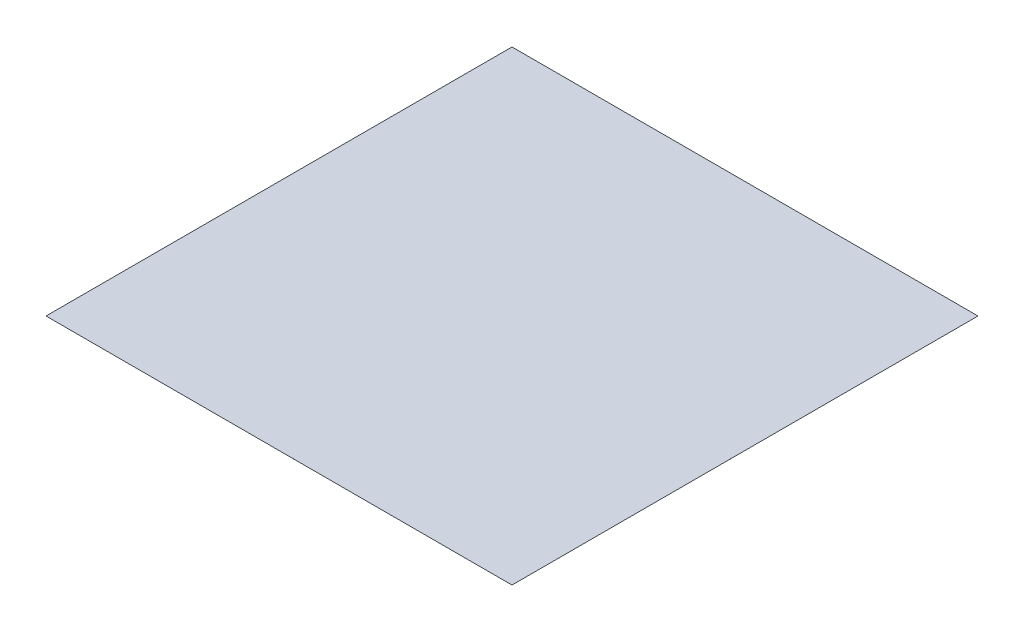
ISO-10303-21;
HEADER;
FILE_DESCRIPTION(('STEP AP214'),'2;1');
FILE_NAME('part.step','',(''),(''),'','','');
FILE_SCHEMA(('AUTOMOTIVE_DESIGN { 1 0 10303 214 1 1 1 1 }'));
ENDSEC;
DATA;
#1=APPLICATION_CONTEXT('core data for automotive mechanical design processes');
#2=APPLICATION_PROTOCOL_DEFINITION('international standard','automotive_design',2000,#1);
#3=PRODUCT_CONTEXT('',#1,'mechanical');
#4=PRODUCT('Part','Part','',(#3));
#5=PRODUCT_RELATED_PRODUCT_CATEGORY('part','',(#4));
#6=PRODUCT_DEFINITION_FORMATION('','',#4);
#7=PRODUCT_DEFINITION_CONTEXT('part definition',#1,'design');
#8=PRODUCT_DEFINITION('design','',#6,#7);
#9=PRODUCT_DEFINITION_SHAPE('','',#8);
#10=(LENGTH_UNIT() NAMED_UNIT(*) SI_UNIT(.MILLI.,.METRE.));
#11=(NAMED_UNIT(*) PLANE_ANGLE_UNIT() SI_UNIT($,.RADIAN.));
#12=(NAMED_UNIT(*) SI_UNIT($,.STERADIAN.) SOLID_ANGLE_UNIT());
#13=UNCERTAINTY_MEASURE_WITH_UNIT(LENGTH_MEASURE(1.E-05),#10,'distance_accuracy_value','');
#14=(GEOMETRIC_REPRESENTATION_CONTEXT(3) GLOBAL_UNCERTAINTY_ASSIGNED_CONTEXT((#13)) GLOBAL_UNIT_ASSIGNED_CONTEXT((#10,
#11,#12)) REPRESENTATION_CONTEXT('',''));
#15=CARTESIAN_POINT('',(0.,0.,0.));
#16=DIRECTION('',(0.,0.,1.));
#17=DIRECTION('',(1.,0.,0.));
#18=AXIS2_PLACEMENT_3D('',#15,#16,#17);
#19=CARTESIAN_POINT('',(2784.,0.0045,2784.));
#20=DIRECTION('',(-1.,0.,0.));
#21=DIRECTION('',(0.,0.,1.));
#22=AXIS2_PLACEMENT_3D('',#19,#20,#21);
#23=PLANE('',#22);
#24=DIRECTION('',(0.,0.,-1.));
#25=VECTOR('',#24,1.);
#26=CARTESIAN_POINT('',(2784.,0.,2784.));
#27=LINE('',#26,#25);
#28=CARTESIAN_POINT('',(2784.,0.,2784.));
#29=VERTEX_POINT('',#28);
#30=CARTESIAN_POINT('',(2784.,0.,-2784.));
#31=VERTEX_POINT('',#30);
#32=EDGE_CURVE('E99',#29,#31,#27,.T.);
#33=ORIENTED_EDGE('',*,*,#32,.T.);
#34=DIRECTION('',(0.,-1.,0.));
#35=VECTOR('',#34,1.);
#36=CARTESIAN_POINT('',(2784.,0.0045,-2784.));
#37=LINE('',#36,#35);
#38=CARTESIAN_POINT('',(2784.,0.0045,-2784.));
#39=VERTEX_POINT('',#38);
#40=EDGE_CURVE('E11',#39,#31,#37,.T.);
#41=ORIENTED_EDGE('',*,*,#40,.F.);
#42=DIRECTION('',(0.,0.,-1.));
#43=VECTOR('',#42,1.);
#44=CARTESIAN_POINT('',(2784.,0.0045,2784.));
#45=LINE('',#44,#43);
#46=CARTESIAN_POINT('',(2784.,0.0045,2784.));
#47=VERTEX_POINT('',#46);
#48=EDGE_CURVE('E87',#47,#39,#45,.T.);
#49=ORIENTED_EDGE('',*,*,#48,.F.);
#50=DIRECTION('',(0.,-1.,0.));
#51=VECTOR('',#50,1.);
#52=CARTESIAN_POINT('',(2784.,0.0045,2784.));
#53=LINE('',#52,#51);
#54=EDGE_CURVE('E95',#47,#29,#53,.T.);
#55=ORIENTED_EDGE('',*,*,#54,.T.);
#56=EDGE_LOOP('',(#33,#41,#49,#55));
#57=FACE_BOUND('',#56,.T.);
#58=ADVANCED_FACE('F36',(#57),#23,.F.);
#59=CARTESIAN_POINT('',(-2784.,0.0045,-2784.));
#60=DIRECTION('',(0.,0.,1.));
#61=DIRECTION('',(1.,0.,0.));
#62=AXIS2_PLACEMENT_3D('',#59,#60,#61);
#63=PLANE('',#62);
#64=DIRECTION('',(-1.,0.,0.));
#65=VECTOR('',#64,1.);
#66=CARTESIAN_POINT('',(-2784.,0.,-2784.));
#67=LINE('',#66,#65);
#68=CARTESIAN_POINT('',(-2784.,0.,-2784.));
#69=VERTEX_POINT('',#68);
#70=EDGE_CURVE('E91',#31,#69,#67,.T.);
#71=ORIENTED_EDGE('',*,*,#70,.T.);
#72=DIRECTION('',(0.,-1.,0.));
#73=VECTOR('',#72,1.);
#74=CARTESIAN_POINT('',(-2784.,0.0045,-2784.));
#75=LINE('',#74,#73);
#76=CARTESIAN_POINT('',(-2784.,0.0045,-2784.));
#77=VERTEX_POINT('',#76);
#78=EDGE_CURVE('E44',#77,#69,#75,.T.);
#79=ORIENTED_EDGE('',*,*,#78,.F.);
#80=DIRECTION('',(-1.,0.,0.));
#81=VECTOR('',#80,1.);
#82=CARTESIAN_POINT('',(-2784.,0.0045,-2784.));
#83=LINE('',#82,#81);
#84=EDGE_CURVE('E82',#39,#77,#83,.T.);
#85=ORIENTED_EDGE('',*,*,#84,.F.);
#86=ORIENTED_EDGE('',*,*,#40,.T.);
#87=EDGE_LOOP('',(#71,#79,#85,#86));
#88=FACE_BOUND('',#87,.T.);
#89=ADVANCED_FACE('F90',(#88),#63,.F.);
#90=CARTESIAN_POINT('',(-2784.,0.0045,2784.));
#91=DIRECTION('',(1.,0.,0.));
#92=DIRECTION('',(0.,0.,-1.));
#93=AXIS2_PLACEMENT_3D('',#90,#91,#92);
#94=PLANE('',#93);
#95=DIRECTION('',(0.,0.,1.));
#96=VECTOR('',#95,1.);
#97=CARTESIAN_POINT('',(-2784.,0.,2784.));
#98=LINE('',#97,#96);
#99=CARTESIAN_POINT('',(-2784.,0.,2784.));
#100=VERTEX_POINT('',#99);
#101=EDGE_CURVE('E69',#69,#100,#98,.T.);
#102=ORIENTED_EDGE('',*,*,#101,.T.);
#103=DIRECTION('',(0.,-1.,0.));
#104=VECTOR('',#103,1.);
#105=CARTESIAN_POINT('',(-2784.,0.0045,2784.));
#106=LINE('',#105,#104);
#107=CARTESIAN_POINT('',(-2784.,0.0045,2784.));
#108=VERTEX_POINT('',#107);
#109=EDGE_CURVE('E92',#108,#100,#106,.T.);
#110=ORIENTED_EDGE('',*,*,#109,.F.);
#111=DIRECTION('',(0.,0.,1.));
#112=VECTOR('',#111,1.);
#113=CARTESIAN_POINT('',(-2784.,0.0045,2784.));
#114=LINE('',#113,#112);
#115=EDGE_CURVE('E85',#77,#108,#114,.T.);
#116=ORIENTED_EDGE('',*,*,#115,.F.);
#117=ORIENTED_EDGE('',*,*,#78,.T.);
#118=EDGE_LOOP('',(#102,#110,#116,#117));
#119=FACE_BOUND('',#118,.T.);
#120=ADVANCED_FACE('F93',(#119),#94,.F.);
#121=CARTESIAN_POINT('',(-2784.,0.0045,2784.));
#122=DIRECTION('',(0.,0.,-1.));
#123=DIRECTION('',(-1.,0.,0.));
#124=AXIS2_PLACEMENT_3D('',#121,#122,#123);
#125=PLANE('',#124);
#126=DIRECTION('',(1.,0.,0.));
#127=VECTOR('',#126,1.);
#128=CARTESIAN_POINT('',(-2784.,0.,2784.));
#129=LINE('',#128,#127);
#130=EDGE_CURVE('E75',#100,#29,#129,.T.);
#131=ORIENTED_EDGE('',*,*,#130,.T.);
#132=ORIENTED_EDGE('',*,*,#54,.F.);
#133=DIRECTION('',(1.,0.,0.));
#134=VECTOR('',#133,1.);
#135=CARTESIAN_POINT('',(-2784.,0.0045,2784.));
#136=LINE('',#135,#134);
#137=EDGE_CURVE('E52',#108,#47,#136,.T.);
#138=ORIENTED_EDGE('',*,*,#137,.F.);
#139=ORIENTED_EDGE('',*,*,#109,.T.);
#140=EDGE_LOOP('',(#131,#132,#138,#139));
#141=FACE_BOUND('',#140,.T.);
#142=ADVANCED_FACE('F106',(#141),#125,.F.);
#143=CARTESIAN_POINT('',(0.,0.0045,0.));
#144=DIRECTION('',(0.,-1.,0.));
#145=DIRECTION('',(0.,0.,-1.));
#146=AXIS2_PLACEMENT_3D('',#143,#144,#145);
#147=PLANE('',#146);
#148=ORIENTED_EDGE('',*,*,#48,.T.);
#149=ORIENTED_EDGE('',*,*,#84,.T.);
#150=ORIENTED_EDGE('',*,*,#115,.T.);
#151=ORIENTED_EDGE('',*,*,#137,.T.);
#152=EDGE_LOOP('',(#148,#149,#150,#151));
#153=FACE_BOUND('',#152,.T.);
#154=ADVANCED_FACE('F83',(#153),#147,.F.);
#155=CARTESIAN_POINT('',(0.,0.,0.));
#156=DIRECTION('',(0.,-1.,0.));
#157=DIRECTION('',(0.,0.,-1.));
#158=AXIS2_PLACEMENT_3D('',#155,#156,#157);
#159=PLANE('',#158);
#160=ORIENTED_EDGE('',*,*,#32,.F.);
#161=ORIENTED_EDGE('',*,*,#130,.F.);
#162=ORIENTED_EDGE('',*,*,#101,.F.);
#163=ORIENTED_EDGE('',*,*,#70,.F.);
#164=EDGE_LOOP('',(#160,#161,#162,#163));
#165=FACE_BOUND('',#164,.T.);
#166=ADVANCED_FACE('F109',(#165),#159,.T.);
#167=CLOSED_SHELL('',(#58,#89,#120,#142,#154,#166));
#168=MANIFOLD_SOLID_BREP('B2',#167);
#169=ADVANCED_BREP_SHAPE_REPRESENTATION('',(#18,#168),#14);
#170=SHAPE_DEFINITION_REPRESENTATION(#9,#169);
ENDSEC;
END-ISO-10303-21;
